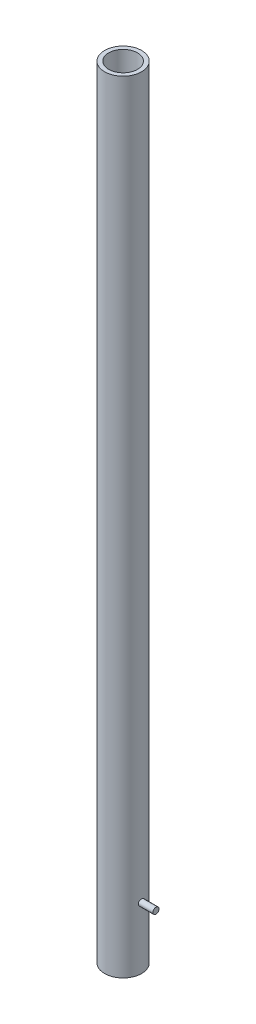
ISO-10303-21;
HEADER;
FILE_DESCRIPTION(('STEP AP214'),'2;1');
FILE_NAME('part.step','',(''),(''),'','','');
FILE_SCHEMA(('AUTOMOTIVE_DESIGN { 1 0 10303 214 1 1 1 1 }'));
ENDSEC;
DATA;
#1=APPLICATION_CONTEXT('core data for automotive mechanical design processes');
#2=APPLICATION_PROTOCOL_DEFINITION('international standard','automotive_design',2000,#1);
#3=PRODUCT_CONTEXT('',#1,'mechanical');
#4=PRODUCT('Part','Part','',(#3));
#5=PRODUCT_RELATED_PRODUCT_CATEGORY('part','',(#4));
#6=PRODUCT_DEFINITION_FORMATION('','',#4);
#7=PRODUCT_DEFINITION_CONTEXT('part definition',#1,'design');
#8=PRODUCT_DEFINITION('design','',#6,#7);
#9=PRODUCT_DEFINITION_SHAPE('','',#8);
#10=(LENGTH_UNIT() NAMED_UNIT(*) SI_UNIT(.MILLI.,.METRE.));
#11=(NAMED_UNIT(*) PLANE_ANGLE_UNIT() SI_UNIT($,.RADIAN.));
#12=(NAMED_UNIT(*) SI_UNIT($,.STERADIAN.) SOLID_ANGLE_UNIT());
#13=UNCERTAINTY_MEASURE_WITH_UNIT(LENGTH_MEASURE(1.E-05),#10,'distance_accuracy_value','');
#14=(GEOMETRIC_REPRESENTATION_CONTEXT(3) GLOBAL_UNCERTAINTY_ASSIGNED_CONTEXT((#13)) GLOBAL_UNIT_ASSIGNED_CONTEXT((#10,
#11,#12)) REPRESENTATION_CONTEXT('',''));
#15=CARTESIAN_POINT('',(0.,0.,0.));
#16=DIRECTION('',(0.,0.,1.));
#17=DIRECTION('',(1.,0.,0.));
#18=AXIS2_PLACEMENT_3D('',#15,#16,#17);
#19=CARTESIAN_POINT('',(0.,380.,0.));
#20=DIRECTION('',(0.,-1.,0.));
#21=DIRECTION('',(0.,0.,-1.));
#22=AXIS2_PLACEMENT_3D('',#19,#20,#21);
#23=CYLINDRICAL_SURFACE('',#22,9.);
#24=CARTESIAN_POINT('',(0.,380.,0.));
#25=DIRECTION('',(0.,1.,0.));
#26=DIRECTION('',(1.,0.,0.));
#27=AXIS2_PLACEMENT_3D('',#24,#25,#26);
#28=CIRCLE('',#27,9.);
#29=CARTESIAN_POINT('',(9.,380.,0.));
#30=VERTEX_POINT('',#29);
#31=EDGE_CURVE('E65',#30,#30,#28,.T.);
#32=ORIENTED_EDGE('',*,*,#31,.F.);
#33=EDGE_LOOP('',(#32));
#34=FACE_BOUND('',#33,.T.);
#35=CARTESIAN_POINT('',(0.,0.,0.));
#36=DIRECTION('',(0.,1.,0.));
#37=DIRECTION('',(1.,0.,0.));
#38=AXIS2_PLACEMENT_3D('',#35,#36,#37);
#39=CIRCLE('',#38,9.);
#40=CARTESIAN_POINT('',(9.,0.,0.));
#41=VERTEX_POINT('',#40);
#42=EDGE_CURVE('E108',#41,#41,#39,.T.);
#43=ORIENTED_EDGE('',*,*,#42,.T.);
#44=EDGE_LOOP('',(#43));
#45=FACE_BOUND('',#44,.T.);
#46=CARTESIAN_POINT('',(8.87411967464942,30.,1.5));
#47=CARTESIAN_POINT('',(8.87412118440766,29.9163745511124,1.4999966390526));
#48=CARTESIAN_POINT('',(8.8753145552884,29.8327034363851,1.49298310142239));
#49=CARTESIAN_POINT('',(8.87995474420907,29.6677088740679,1.46512645684524));
#50=CARTESIAN_POINT('',(8.88340364034856,29.5863876637503,1.44427059618579));
#51=CARTESIAN_POINT('',(8.89215365593394,29.4285046299859,1.38937772620029));
#52=CARTESIAN_POINT('',(8.8974532270317,29.3519388908002,1.35535173295865));
#53=CARTESIAN_POINT('',(8.90930563268603,29.2056114271718,1.27511189813422));
#54=CARTESIAN_POINT('',(8.91585832618484,29.1358489382543,1.22889942810094));
#55=CARTESIAN_POINT('',(8.92955082691565,29.0044122901526,1.12511251617978));
#56=CARTESIAN_POINT('',(8.93669530396241,28.9428149211681,1.06744142935937));
#57=CARTESIAN_POINT('',(8.95072488401675,28.8301240158831,0.942583202817206));
#58=CARTESIAN_POINT('',(8.95760997163183,28.7790311021308,0.875395499489996));
#59=CARTESIAN_POINT('',(8.97039442189482,28.6885112596684,0.732913721969004));
#60=CARTESIAN_POINT('',(8.97628765459366,28.6491557953609,0.657573648874023));
#61=CARTESIAN_POINT('',(8.98637242174293,28.5836873576817,0.501237373034323));
#62=CARTESIAN_POINT('',(8.99056406683605,28.5575735232691,0.420241538446914));
#63=CARTESIAN_POINT('',(8.99674040834628,28.5195644790097,0.255686235806545));
#64=CARTESIAN_POINT('',(8.99874511866543,28.5075402503972,0.172157332007563));
#65=CARTESIAN_POINT('',(9.00039047605669,28.4976505475084,0.00424517131547886));
#66=CARTESIAN_POINT('',(9.00003128381585,28.4997841108517,-0.0801380271173387));
#67=CARTESIAN_POINT('',(8.99700515058833,28.5180488109169,-0.246481311047325));
#68=CARTESIAN_POINT('',(8.99436110215438,28.5340410980455,-0.328457118420084));
#69=CARTESIAN_POINT('',(8.98708787262982,28.5793506445479,-0.488545187767075));
#70=CARTESIAN_POINT('',(8.98245863107927,28.6086683097537,-0.566657331990903));
#71=CARTESIAN_POINT('',(8.97169619107175,28.6799343841892,-0.717213688669589));
#72=CARTESIAN_POINT('',(8.96555620396128,28.7219400072495,-0.789630313811427));
#73=CARTESIAN_POINT('',(8.95245442842898,28.817347693581,-0.926439317907985));
#74=CARTESIAN_POINT('',(8.94549257351481,28.8707506792265,-0.990831046749526));
#75=CARTESIAN_POINT('',(8.93142160939558,28.9882072839716,-1.110582764068));
#76=CARTESIAN_POINT('',(8.92431173838625,29.0523822569406,-1.16582370135192));
#77=CARTESIAN_POINT('',(8.91082775870884,29.1891522541295,-1.26477275306884));
#78=CARTESIAN_POINT('',(8.90445365682795,29.2617473560097,-1.30848076111945));
#79=CARTESIAN_POINT('',(8.8931625273709,29.4134349851265,-1.38314666069297));
#80=CARTESIAN_POINT('',(8.88824713981561,29.4925346988553,-1.41409021636755));
#81=CARTESIAN_POINT('',(8.88045713213928,29.6549094433845,-1.46221792248937));
#82=CARTESIAN_POINT('',(8.87758233232993,29.7381841058595,-1.47940328446077));
#83=CARTESIAN_POINT('',(8.8742337565327,29.9054796936973,-1.49935913092756));
#84=CARTESIAN_POINT('',(8.87373171455201,29.9894798278213,-1.50229932474747));
#85=CARTESIAN_POINT('',(8.87511020869417,30.1567720030145,-1.49413362160948));
#86=CARTESIAN_POINT('',(8.87699065279112,30.2400640713084,-1.4830282671748));
#87=CARTESIAN_POINT('',(8.88289612473011,30.4030366555145,-1.44723140095686));
#88=CARTESIAN_POINT('',(8.88690751151009,30.4827366839268,-1.42262627438783));
#89=CARTESIAN_POINT('',(8.89661143803301,30.6368820997677,-1.36061891411537));
#90=CARTESIAN_POINT('',(8.90230407834347,30.7113271725305,-1.32321591486056));
#91=CARTESIAN_POINT('',(8.91479477038436,30.8536047566437,-1.23627400393754));
#92=CARTESIAN_POINT('',(8.92160253360208,30.9213699436536,-1.18662633849562));
#93=CARTESIAN_POINT('',(8.9355280000792,31.047668119617,-1.07675367942479));
#94=CARTESIAN_POINT('',(8.94264572511199,31.1062004586658,-1.01652794183043));
#95=CARTESIAN_POINT('',(8.95647853270959,31.2129911356372,-0.886456842197285));
#96=CARTESIAN_POINT('',(8.96318865806804,31.2611362957707,-0.816517952031716));
#97=CARTESIAN_POINT('',(8.97537067459765,31.3449931962029,-0.669446068769592));
#98=CARTESIAN_POINT('',(8.98084260581986,31.3807053386843,-0.592313308482373));
#99=CARTESIAN_POINT('',(8.9899101490175,31.4385063503729,-0.433379430900793));
#100=CARTESIAN_POINT('',(8.99351390740573,31.460654445441,-0.351600337561563));
#101=CARTESIAN_POINT('',(8.99847349901569,31.4908893593783,-0.185418440924525));
#102=CARTESIAN_POINT('',(8.99982951720106,31.4989773352394,-0.101015854092973));
#103=CARTESIAN_POINT('',(9.00013822732695,31.5008291293873,0.0669247654642083));
#104=CARTESIAN_POINT('',(8.99911981214544,31.4947651523646,0.150460896361607));
#105=CARTESIAN_POINT('',(8.9948530703237,31.4688576466384,0.315307184588813));
#106=CARTESIAN_POINT('',(8.99160475617001,31.4490141950943,0.396617354380454));
#107=CARTESIAN_POINT('',(8.98324193296551,31.3961771006737,0.554637867551155));
#108=CARTESIAN_POINT('',(8.97812950224933,31.3631980990737,0.631353223292412));
#109=CARTESIAN_POINT('',(8.96659654126411,31.2850452382619,0.778188271789178));
#110=CARTESIAN_POINT('',(8.96017594898929,31.2398708009634,0.848307651670479));
#111=CARTESIAN_POINT('',(8.94664577771383,31.1379989445228,0.980827767316295));
#112=CARTESIAN_POINT('',(8.9395291473044,31.0811754271459,1.04313085836337));
#113=CARTESIAN_POINT('',(8.92545781982852,30.9578830152611,1.15737832556882));
#114=CARTESIAN_POINT('',(8.91850316108162,30.8914118646651,1.20932027202071));
#115=CARTESIAN_POINT('',(8.90549006142059,30.7501528064954,1.30170856255177));
#116=CARTESIAN_POINT('',(8.89943830788741,30.6753093960972,1.34207099345672));
#117=CARTESIAN_POINT('',(8.88899526133062,30.5198344584531,1.40958872186455));
#118=CARTESIAN_POINT('',(8.88460231050764,30.4392088063819,1.43675721313896));
#119=CARTESIAN_POINT('',(8.87894846902668,30.298557738314,1.47121563187329));
#120=CARTESIAN_POINT('',(8.8771477405261,30.2393839152249,1.48199245060217));
#121=CARTESIAN_POINT('',(8.87473281171912,30.1201479090953,1.49638577710945));
#122=CARTESIAN_POINT('',(8.87411858987266,30.0600857422019,1.50000241487516));
#123=CARTESIAN_POINT('',(8.87411967464942,30.,1.5));
#124=B_SPLINE_CURVE_WITH_KNOTS('',3,(#46,#47,#48,#49,#50,#51,#52,#53,#54,#55,#56,#57,#58,#59,
#60,#61,#62,#63,#64,#65,#66,#67,#68,#69,#70,#71,#72,#73,#74,#75,#76,#77,#78,#79,#80,#81,#82,#83,
#84,#85,#86,#87,#88,#89,#90,#91,#92,#93,#94,#95,#96,#97,#98,#99,#100,#101,#102,#103,#104,#105,
#106,#107,#108,#109,#110,#111,#112,#113,#114,#115,#116,#117,#118,#119,#120,#121,#122,#123),
.UNSPECIFIED.,.T.,.F.,(4,2,2,2,2,2,2,2,2,2,2,2,2,2,2,2,2,2,2,2,2,2,2,2,2,2,2,2,2,2,2,2,2,2,2,2,
2,2,4),(0.,0.250656623343192,0.50154451195167,0.752222998698996,1.00287328440553,
1.25573495490817,1.50861160698057,1.7629978806425,2.01736761064057,2.26938940480928,
2.52139406789004,2.7709027269619,3.02041898547109,3.27107762481044,3.52175655733447,
3.77547674074663,4.02919926445,4.28320597496552,4.53719031560235,4.78814125449636,
5.03908250045775,5.28843638778685,5.53780519373534,5.78947405655011,6.04116062655803,
6.29546467818619,6.54976050283409,6.80293790647977,7.056094475448,7.30618665756939,
7.55627743928684,7.80609023896863,8.05591488232791,8.3086019847534,8.56134827326477,
8.81588236567711,9.07016140042577,9.25026402322163,9.43036337636996),.UNSPECIFIED.);
#125=CARTESIAN_POINT('',(8.87411967464942,30.,1.5));
#126=VERTEX_POINT('',#125);
#127=EDGE_CURVE('E11',#126,#126,#124,.T.);
#128=ORIENTED_EDGE('',*,*,#127,.F.);
#129=EDGE_LOOP('',(#128));
#130=FACE_BOUND('',#129,.T.);
#131=ADVANCED_FACE('F43',(#34,#45,#130),#23,.T.);
#132=CARTESIAN_POINT('',(0.,380.,0.));
#133=DIRECTION('',(0.,1.,0.));
#134=DIRECTION('',(0.,0.,1.));
#135=AXIS2_PLACEMENT_3D('',#132,#133,#134);
#136=PLANE('',#135);
#137=ORIENTED_EDGE('',*,*,#31,.T.);
#138=EDGE_LOOP('',(#137));
#139=FACE_BOUND('',#138,.T.);
#140=CARTESIAN_POINT('',(0.,380.,0.));
#141=DIRECTION('',(0.,1.,0.));
#142=DIRECTION('',(0.,0.,1.));
#143=AXIS2_PLACEMENT_3D('',#140,#141,#142);
#144=CIRCLE('',#143,7.);
#145=CARTESIAN_POINT('',(0.,380.,7.));
#146=VERTEX_POINT('',#145);
#147=EDGE_CURVE('E111',#146,#146,#144,.T.);
#148=ORIENTED_EDGE('',*,*,#147,.F.);
#149=EDGE_LOOP('',(#148));
#150=FACE_BOUND('',#149,.T.);
#151=ADVANCED_FACE('F95',(#139,#150),#136,.T.);
#152=CARTESIAN_POINT('',(0.,0.,0.));
#153=DIRECTION('',(0.,1.,0.));
#154=DIRECTION('',(0.,0.,1.));
#155=AXIS2_PLACEMENT_3D('',#152,#153,#154);
#156=PLANE('',#155);
#157=ORIENTED_EDGE('',*,*,#42,.F.);
#158=EDGE_LOOP('',(#157));
#159=FACE_BOUND('',#158,.T.);
#160=CARTESIAN_POINT('',(0.,0.,0.));
#161=DIRECTION('',(0.,1.,0.));
#162=DIRECTION('',(0.,0.,1.));
#163=AXIS2_PLACEMENT_3D('',#160,#161,#162);
#164=CIRCLE('',#163,7.);
#165=CARTESIAN_POINT('',(0.,0.,7.));
#166=VERTEX_POINT('',#165);
#167=EDGE_CURVE('E116',#166,#166,#164,.T.);
#168=ORIENTED_EDGE('',*,*,#167,.T.);
#169=EDGE_LOOP('',(#168));
#170=FACE_BOUND('',#169,.T.);
#171=ADVANCED_FACE('F100',(#159,#170),#156,.F.);
#172=CARTESIAN_POINT('',(0.,380.,0.));
#173=DIRECTION('',(0.,-1.,0.));
#174=DIRECTION('',(0.,0.,-1.));
#175=AXIS2_PLACEMENT_3D('',#172,#173,#174);
#176=CYLINDRICAL_SURFACE('',#175,7.);
#177=CARTESIAN_POINT('',(-6.83739716558867,4.5,-1.5));
#178=CARTESIAN_POINT('',(-6.83739884558951,4.58321115248195,-1.49999708238613));
#179=CARTESIAN_POINT('',(-6.83893272341929,4.66645777394212,-1.49305236244768));
#180=CARTESIAN_POINT('',(-6.84489178429867,4.83058667224201,-1.46548559252999));
#181=CARTESIAN_POINT('',(-6.84931911211841,4.9114671486762,-1.44485339653622));
#182=CARTESIAN_POINT('',(-6.86054115293409,5.0684657495742,-1.39058863684599));
#183=CARTESIAN_POINT('',(-6.86733332725825,5.14458887812147,-1.35697000991314));
#184=CARTESIAN_POINT('',(-6.88251670848644,5.29011527394461,-1.27772617673341));
#185=CARTESIAN_POINT('',(-6.89090786877545,5.35951873702908,-1.23210132048776));
#186=CARTESIAN_POINT('',(-6.90849578796654,5.49076296148212,-1.12935142570221));
#187=CARTESIAN_POINT('',(-6.91770249871754,5.55247887623996,-1.07206859483983));
#188=CARTESIAN_POINT('',(-6.93579691710397,5.66550355440578,-0.947969508129577));
#189=CARTESIAN_POINT('',(-6.94468460051416,5.71681152886007,-0.881152530217676));
#190=CARTESIAN_POINT('',(-6.96124769109432,5.80805544449143,-0.739047288464582));
#191=CARTESIAN_POINT('',(-6.96890998819429,5.84787165577062,-0.663680488229954));
#192=CARTESIAN_POINT('',(-6.98204671042934,5.91422769144629,-0.507134269342595));
#193=CARTESIAN_POINT('',(-6.98752137103329,5.94076894478628,-0.425955477380312));
#194=CARTESIAN_POINT('',(-6.9955956528118,5.97942997093134,-0.261387187671511));
#195=CARTESIAN_POINT('',(-6.99823733378385,5.99176092855243,-0.178049400596923));
#196=CARTESIAN_POINT('',(-7.00049362207002,6.00231127731326,-0.0104489453066446));
#197=CARTESIAN_POINT('',(-7.00010856232698,6.00053222056076,0.0738136201647593));
#198=CARTESIAN_POINT('',(-6.99638700862558,5.98307103533642,0.239417029250512));
#199=CARTESIAN_POINT('',(-6.99309883152432,5.96761649971008,0.320783115362113));
#200=CARTESIAN_POINT('',(-6.98399541589104,5.92360531814814,0.479739463978389));
#201=CARTESIAN_POINT('',(-6.97818006616518,5.89504809570026,0.557329560175054));
#202=CARTESIAN_POINT('',(-6.96459754646858,5.82543854111148,0.707167497556553));
#203=CARTESIAN_POINT('',(-6.95681685803946,5.78429923279565,0.779373657015789));
#204=CARTESIAN_POINT('',(-6.94015793743865,5.6907580318364,0.915940926562847));
#205=CARTESIAN_POINT('',(-6.93127956144693,5.6383546626997,0.980301006451528));
#206=CARTESIAN_POINT('',(-6.91319326460925,5.52253145547214,1.10070208800198));
#207=CARTESIAN_POINT('',(-6.90398230372853,5.45891242064296,1.1565511732025));
#208=CARTESIAN_POINT('',(-6.88643566831974,5.32311671493149,1.25682243234728));
#209=CARTESIAN_POINT('',(-6.87810001563386,5.25093983059475,1.30124432118068));
#210=CARTESIAN_POINT('',(-6.86324023586723,5.09977549893624,1.37748077573296));
#211=CARTESIAN_POINT('',(-6.85672115127775,5.02076987614756,1.40926035088923));
#212=CARTESIAN_POINT('',(-6.84630340806617,4.85836723405356,1.45903495159115));
#213=CARTESIAN_POINT('',(-6.84240435218483,4.77497088255681,1.47703206694628));
#214=CARTESIAN_POINT('',(-6.83774881255446,4.60790424735029,1.49843586024652));
#215=CARTESIAN_POINT('',(-6.83693227051701,4.5242713249227,1.5021214192864));
#216=CARTESIAN_POINT('',(-6.83837239573994,4.3575860068183,1.49555139642373));
#217=CARTESIAN_POINT('',(-6.84062886101063,4.27453357334645,1.48529673081635));
#218=CARTESIAN_POINT('',(-6.84790415484206,4.11232956501924,1.45137894635584));
#219=CARTESIAN_POINT('',(-6.85289155274364,4.03314456740304,1.42786830251553));
#220=CARTESIAN_POINT('',(-6.86503859869777,3.87983766246708,1.36827052946749));
#221=CARTESIAN_POINT('',(-6.87219844772849,3.80571622436581,1.33218223662818));
#222=CARTESIAN_POINT('',(-6.88801634080345,3.66343031524108,1.24783504416705));
#223=CARTESIAN_POINT('',(-6.89669501746317,3.59537041798781,1.19940368590792));
#224=CARTESIAN_POINT('',(-6.91451775360139,3.46824165412621,1.09197183833601));
#225=CARTESIAN_POINT('',(-6.92366186834461,3.40917385855153,1.03297009182161));
#226=CARTESIAN_POINT('',(-6.94158239990173,3.30062969705524,0.904812764420814));
#227=CARTESIAN_POINT('',(-6.95034935607746,3.25134308384299,0.835494925828771));
#228=CARTESIAN_POINT('',(-6.96635610714901,3.16511459064895,0.689401481282276));
#229=CARTESIAN_POINT('',(-6.97359597176692,3.12817214702717,0.61262621604374));
#230=CARTESIAN_POINT('',(-6.98569278381574,3.06794794536152,0.454265418982041));
#231=CARTESIAN_POINT('',(-6.99056443803698,3.04458169625372,0.372713193075173));
#232=CARTESIAN_POINT('',(-6.9974393930198,3.01190829426768,0.20672517700329));
#233=CARTESIAN_POINT('',(-6.99944309312296,3.00259918402609,0.122289789973994));
#234=CARTESIAN_POINT('',(-7.00034511009057,2.99838934758814,-0.0452637170528282));
#235=CARTESIAN_POINT('',(-6.99930459001667,3.00320484139538,-0.128374505509229));
#236=CARTESIAN_POINT('',(-6.99436552363383,3.02647476351903,-0.29257293841596));
#237=CARTESIAN_POINT('',(-6.99046702473686,3.04492896557832,-0.373660616405284));
#238=CARTESIAN_POINT('',(-6.98025388638537,3.09481880624949,-0.531301948487269));
#239=CARTESIAN_POINT('',(-6.97394646430493,3.12621568938556,-0.607868365073177));
#240=CARTESIAN_POINT('',(-6.95959036050661,3.20106127116912,-0.75468495672322));
#241=CARTESIAN_POINT('',(-6.9515415172034,3.24451108830603,-0.824934544796141));
#242=CARTESIAN_POINT('',(-6.93439809934493,3.34316231874267,-0.958512306895243));
#243=CARTESIAN_POINT('',(-6.92528708907874,3.39856415832131,-1.02169036510577));
#244=CARTESIAN_POINT('',(-6.90713690075836,3.51914061025035,-1.13795001457643));
#245=CARTESIAN_POINT('',(-6.89809774045682,3.5843175633556,-1.19102918062422));
#246=CARTESIAN_POINT('',(-6.88098693651916,3.72359049318567,-1.28623261596675));
#247=CARTESIAN_POINT('',(-6.87292905956533,3.79778935828702,-1.32820897809616));
#248=CARTESIAN_POINT('',(-6.85886497228049,3.95234372092325,-1.39903004659825));
#249=CARTESIAN_POINT('',(-6.85285699581573,4.03269384525307,-1.42788606423931));
#250=CARTESIAN_POINT('',(-6.84470560641996,4.17762613118586,-1.46638607121557));
#251=CARTESIAN_POINT('',(-6.84198283087953,4.24141167570783,-1.47896752507743));
#252=CARTESIAN_POINT('',(-6.83832799504406,4.37012431157732,-1.49577544043437));
#253=CARTESIAN_POINT('',(-6.83739585430069,4.43505135150832,-1.50000227727981));
#254=CARTESIAN_POINT('',(-6.83739716558867,4.5,-1.5));
#255=B_SPLINE_CURVE_WITH_KNOTS('',3,(#177,#178,#179,#180,#181,#182,#183,#184,#185,#186,#187,
#188,#189,#190,#191,#192,#193,#194,#195,#196,#197,#198,#199,#200,#201,#202,#203,#204,#205,#206,
#207,#208,#209,#210,#211,#212,#213,#214,#215,#216,#217,#218,#219,#220,#221,#222,#223,#224,#225,
#226,#227,#228,#229,#230,#231,#232,#233,#234,#235,#236,#237,#238,#239,#240,#241,#242,#243,#244,
#245,#246,#247,#248,#249,#250,#251,#252,#253,#254),.UNSPECIFIED.,.T.,.F.,(4,2,2,2,2,2,2,2,2,2,2,
2,2,2,2,2,2,2,2,2,2,2,2,2,2,2,2,2,2,2,2,2,2,2,2,2,2,2,4),(0.,0.249395482027528,
0.498976038479964,0.74828949115276,0.997595676735284,1.25053229582692,1.50348808112879,
1.75899134820278,2.01446710646267,2.26609508151929,2.51769537777241,2.76518557667371,
3.01268666607584,3.26193888143437,3.51122378872315,3.76548960779295,4.01976177023092,
4.27473287411781,4.52966530953838,4.77960433192523,5.02952692653916,5.27663180749375,
5.5237595556315,5.77455010216318,6.02537049659078,6.2806621468321,6.53594213875541,
6.78961589824375,7.04325433208539,7.29183199644126,7.540405537151,7.78824009619483,
8.03609766151365,8.28848914160965,8.54094115631232,8.79660380167248,9.05204561611687,
9.24671456122272,9.44137476018022),.UNSPECIFIED.);
#256=CARTESIAN_POINT('',(-6.83739716558867,4.5,-1.5));
#257=VERTEX_POINT('',#256);
#258=EDGE_CURVE('E55',#257,#257,#255,.T.);
#259=ORIENTED_EDGE('',*,*,#258,.F.);
#260=EDGE_LOOP('',(#259));
#261=FACE_BOUND('',#260,.T.);
#262=CARTESIAN_POINT('',(6.83739716558867,4.5,-1.5));
#263=CARTESIAN_POINT('',(6.83739884558951,4.41678884751805,-1.49999708238613));
#264=CARTESIAN_POINT('',(6.83893272341929,4.33354222605788,-1.49305236244768));
#265=CARTESIAN_POINT('',(6.84489178429867,4.16941332775799,-1.46548559252999));
#266=CARTESIAN_POINT('',(6.84931911211841,4.08853285132379,-1.44485339653622));
#267=CARTESIAN_POINT('',(6.86054115293409,3.9315342504258,-1.39058863684599));
#268=CARTESIAN_POINT('',(6.86733332725825,3.85541112187853,-1.35697000991314));
#269=CARTESIAN_POINT('',(6.88251670848644,3.70988472605539,-1.27772617673341));
#270=CARTESIAN_POINT('',(6.89090786877545,3.64048126297092,-1.23210132048776));
#271=CARTESIAN_POINT('',(6.90849578796654,3.50923703851788,-1.12935142570221));
#272=CARTESIAN_POINT('',(6.91770249871754,3.44752112376004,-1.07206859483983));
#273=CARTESIAN_POINT('',(6.93579691710397,3.33449644559421,-0.947969508129577));
#274=CARTESIAN_POINT('',(6.94468460051417,3.28318847113993,-0.881152530217676));
#275=CARTESIAN_POINT('',(6.96124769109432,3.19194455550857,-0.739047288464582));
#276=CARTESIAN_POINT('',(6.96890998819429,3.15212834422938,-0.663680488229953));
#277=CARTESIAN_POINT('',(6.98204671042934,3.08577230855371,-0.507134269342595));
#278=CARTESIAN_POINT('',(6.98752137103329,3.05923105521372,-0.425955477380312));
#279=CARTESIAN_POINT('',(6.9955956528118,3.02057002906866,-0.261387187671512));
#280=CARTESIAN_POINT('',(6.99823733378385,3.00823907144757,-0.178049400596924));
#281=CARTESIAN_POINT('',(7.00049362207002,2.99768872268674,-0.010448945306645));
#282=CARTESIAN_POINT('',(7.00010856232698,2.99946777943924,0.0738136201647588));
#283=CARTESIAN_POINT('',(6.99638700862558,3.01692896466358,0.239417029250511));
#284=CARTESIAN_POINT('',(6.99309883152432,3.03238350028992,0.320783115362112));
#285=CARTESIAN_POINT('',(6.98399541589104,3.07639468185186,0.479739463978389));
#286=CARTESIAN_POINT('',(6.97818006616518,3.10495190429974,0.557329560175054));
#287=CARTESIAN_POINT('',(6.96459754646858,3.17456145888852,0.707167497556552));
#288=CARTESIAN_POINT('',(6.95681685803946,3.21570076720435,0.779373657015788));
#289=CARTESIAN_POINT('',(6.94015793743865,3.3092419681636,0.915940926562846));
#290=CARTESIAN_POINT('',(6.93127956144693,3.3616453373003,0.980301006451528));
#291=CARTESIAN_POINT('',(6.91319326460925,3.47746854452786,1.10070208800198));
#292=CARTESIAN_POINT('',(6.90398230372853,3.54108757935703,1.1565511732025));
#293=CARTESIAN_POINT('',(6.88643566831974,3.67688328506851,1.25682243234728));
#294=CARTESIAN_POINT('',(6.87810001563386,3.74906016940525,1.30124432118068));
#295=CARTESIAN_POINT('',(6.86324023586723,3.90022450106376,1.37748077573296));
#296=CARTESIAN_POINT('',(6.85672115127775,3.97923012385244,1.40926035088923));
#297=CARTESIAN_POINT('',(6.84630340806617,4.14163276594644,1.45903495159115));
#298=CARTESIAN_POINT('',(6.84240435218483,4.22502911744319,1.47703206694628));
#299=CARTESIAN_POINT('',(6.83774881255446,4.39209575264971,1.49843586024652));
#300=CARTESIAN_POINT('',(6.83693227051701,4.4757286750773,1.5021214192864));
#301=CARTESIAN_POINT('',(6.83837239573994,4.64241399318169,1.49555139642373));
#302=CARTESIAN_POINT('',(6.84062886101063,4.72546642665355,1.48529673081635));
#303=CARTESIAN_POINT('',(6.84790415484206,4.88767043498076,1.45137894635584));
#304=CARTESIAN_POINT('',(6.85289155274364,4.96685543259696,1.42786830251553));
#305=CARTESIAN_POINT('',(6.86503859869777,5.12016233753292,1.3682705294675));
#306=CARTESIAN_POINT('',(6.87219844772849,5.19428377563419,1.33218223662818));
#307=CARTESIAN_POINT('',(6.88801634080345,5.33656968475892,1.24783504416705));
#308=CARTESIAN_POINT('',(6.89669501746317,5.40462958201218,1.19940368590792));
#309=CARTESIAN_POINT('',(6.91451775360139,5.53175834587379,1.09197183833601));
#310=CARTESIAN_POINT('',(6.92366186834461,5.59082614144847,1.03297009182161));
#311=CARTESIAN_POINT('',(6.94158239990173,5.69937030294476,0.904812764420814));
#312=CARTESIAN_POINT('',(6.95034935607746,5.74865691615701,0.83549492582877));
#313=CARTESIAN_POINT('',(6.96635610714901,5.83488540935105,0.689401481282276));
#314=CARTESIAN_POINT('',(6.97359597176692,5.87182785297283,0.61262621604374));
#315=CARTESIAN_POINT('',(6.98569278381574,5.93205205463848,0.454265418982041));
#316=CARTESIAN_POINT('',(6.99056443803698,5.95541830374628,0.372713193075173));
#317=CARTESIAN_POINT('',(6.9974393930198,5.98809170573232,0.20672517700329));
#318=CARTESIAN_POINT('',(6.99944309312296,5.99740081597391,0.122289789973994));
#319=CARTESIAN_POINT('',(7.00034511009057,6.00161065241186,-0.0452637170528278));
#320=CARTESIAN_POINT('',(6.99930459001667,5.99679515860462,-0.128374505509228));
#321=CARTESIAN_POINT('',(6.99436552363383,5.97352523648097,-0.292572938415959));
#322=CARTESIAN_POINT('',(6.99046702473686,5.95507103442168,-0.373660616405284));
#323=CARTESIAN_POINT('',(6.98025388638537,5.90518119375051,-0.531301948487269));
#324=CARTESIAN_POINT('',(6.97394646430492,5.87378431061444,-0.607868365073176));
#325=CARTESIAN_POINT('',(6.95959036050661,5.79893872883088,-0.754684956723219));
#326=CARTESIAN_POINT('',(6.9515415172034,5.75548891169397,-0.82493454479614));
#327=CARTESIAN_POINT('',(6.93439809934494,5.65683768125733,-0.958512306895243));
#328=CARTESIAN_POINT('',(6.92528708907874,5.60143584167869,-1.02169036510577));
#329=CARTESIAN_POINT('',(6.90713690075836,5.48085938974965,-1.13795001457643));
#330=CARTESIAN_POINT('',(6.89809774045682,5.41568243664439,-1.19102918062422));
#331=CARTESIAN_POINT('',(6.88098693651916,5.27640950681433,-1.28623261596675));
#332=CARTESIAN_POINT('',(6.87292905956533,5.20221064171298,-1.32820897809616));
#333=CARTESIAN_POINT('',(6.85886497228049,5.04765627907675,-1.39903004659825));
#334=CARTESIAN_POINT('',(6.85285699581573,4.96730615474693,-1.42788606423931));
#335=CARTESIAN_POINT('',(6.84470560641996,4.82237386881414,-1.46638607121557));
#336=CARTESIAN_POINT('',(6.84198283087953,4.75858832429217,-1.47896752507743));
#337=CARTESIAN_POINT('',(6.83832799504406,4.62987568842268,-1.49577544043437));
#338=CARTESIAN_POINT('',(6.83739585430069,4.56494864849168,-1.50000227727981));
#339=CARTESIAN_POINT('',(6.83739716558867,4.5,-1.5));
#340=B_SPLINE_CURVE_WITH_KNOTS('',3,(#262,#263,#264,#265,#266,#267,#268,#269,#270,#271,#272,
#273,#274,#275,#276,#277,#278,#279,#280,#281,#282,#283,#284,#285,#286,#287,#288,#289,#290,#291,
#292,#293,#294,#295,#296,#297,#298,#299,#300,#301,#302,#303,#304,#305,#306,#307,#308,#309,#310,
#311,#312,#313,#314,#315,#316,#317,#318,#319,#320,#321,#322,#323,#324,#325,#326,#327,#328,#329,
#330,#331,#332,#333,#334,#335,#336,#337,#338,#339),.UNSPECIFIED.,.T.,.F.,(4,2,2,2,2,2,2,2,2,2,2,
2,2,2,2,2,2,2,2,2,2,2,2,2,2,2,2,2,2,2,2,2,2,2,2,2,2,2,4),(0.,0.249395482027528,
0.498976038479964,0.748289491152759,0.997595676735283,1.25053229582692,1.50348808112879,
1.75899134820278,2.01446710646267,2.26609508151929,2.51769537777241,2.76518557667371,
3.01268666607584,3.26193888143437,3.51122378872315,3.76548960779295,4.01976177023092,
4.27473287411781,4.52966530953839,4.77960433192523,5.02952692653916,5.27663180749375,
5.5237595556315,5.77455010216318,6.02537049659078,6.2806621468321,6.53594213875541,
6.78961589824375,7.04325433208539,7.29183199644126,7.54040553715099,7.78824009619483,
8.03609766151365,8.28848914160965,8.54094115631232,8.79660380167248,9.05204561611687,
9.24671456122272,9.44137476018022),.UNSPECIFIED.);
#341=CARTESIAN_POINT('',(6.83739716558867,4.5,-1.5));
#342=VERTEX_POINT('',#341);
#343=EDGE_CURVE('E60',#342,#342,#340,.T.);
#344=ORIENTED_EDGE('',*,*,#343,.F.);
#345=EDGE_LOOP('',(#344));
#346=FACE_BOUND('',#345,.T.);
#347=ORIENTED_EDGE('',*,*,#147,.T.);
#348=EDGE_LOOP('',(#347));
#349=FACE_BOUND('',#348,.T.);
#350=ORIENTED_EDGE('',*,*,#167,.F.);
#351=EDGE_LOOP('',(#350));
#352=FACE_BOUND('',#351,.T.);
#353=ADVANCED_FACE('F76',(#261,#346,#349,#352),#176,.F.);
#354=CARTESIAN_POINT('',(-9.002,4.5,0.));
#355=DIRECTION('',(1.,0.,0.));
#356=DIRECTION('',(0.,0.,-1.));
#357=AXIS2_PLACEMENT_3D('',#354,#355,#356);
#358=CYLINDRICAL_SURFACE('',#357,1.5);
#359=ORIENTED_EDGE('',*,*,#258,.T.);
#360=EDGE_LOOP('',(#359));
#361=FACE_BOUND('',#360,.T.);
#362=ORIENTED_EDGE('',*,*,#343,.T.);
#363=EDGE_LOOP('',(#362));
#364=FACE_BOUND('',#363,.T.);
#365=ADVANCED_FACE('F79',(#361,#364),#358,.T.);
#366=CARTESIAN_POINT('',(16.,30.,0.));
#367=DIRECTION('',(-1.,0.,0.));
#368=DIRECTION('',(0.,0.,1.));
#369=AXIS2_PLACEMENT_3D('',#366,#367,#368);
#370=CYLINDRICAL_SURFACE('',#369,1.5);
#371=CARTESIAN_POINT('',(16.,30.,0.));
#372=DIRECTION('',(1.,0.,0.));
#373=DIRECTION('',(0.,0.,-1.));
#374=AXIS2_PLACEMENT_3D('',#371,#372,#373);
#375=CIRCLE('',#374,1.5);
#376=CARTESIAN_POINT('',(16.,30.,-1.5));
#377=VERTEX_POINT('',#376);
#378=EDGE_CURVE('E121',#377,#377,#375,.T.);
#379=ORIENTED_EDGE('',*,*,#378,.F.);
#380=EDGE_LOOP('',(#379));
#381=FACE_BOUND('',#380,.T.);
#382=ORIENTED_EDGE('',*,*,#127,.T.);
#383=EDGE_LOOP('',(#382));
#384=FACE_BOUND('',#383,.T.);
#385=ADVANCED_FACE('F82',(#381,#384),#370,.T.);
#386=CARTESIAN_POINT('',(16.,30.,0.));
#387=DIRECTION('',(1.,0.,0.));
#388=DIRECTION('',(0.,0.,-1.));
#389=AXIS2_PLACEMENT_3D('',#386,#387,#388);
#390=PLANE('',#389);
#391=ORIENTED_EDGE('',*,*,#378,.T.);
#392=EDGE_LOOP('',(#391));
#393=FACE_BOUND('',#392,.T.);
#394=ADVANCED_FACE('F87',(#393),#390,.T.);
#395=CLOSED_SHELL('',(#131,#151,#171,#353,#365,#385,#394));
#396=MANIFOLD_SOLID_BREP('B2',#395);
#397=ADVANCED_BREP_SHAPE_REPRESENTATION('',(#18,#396),#14);
#398=SHAPE_DEFINITION_REPRESENTATION(#9,#397);
ENDSEC;
END-ISO-10303-21;
